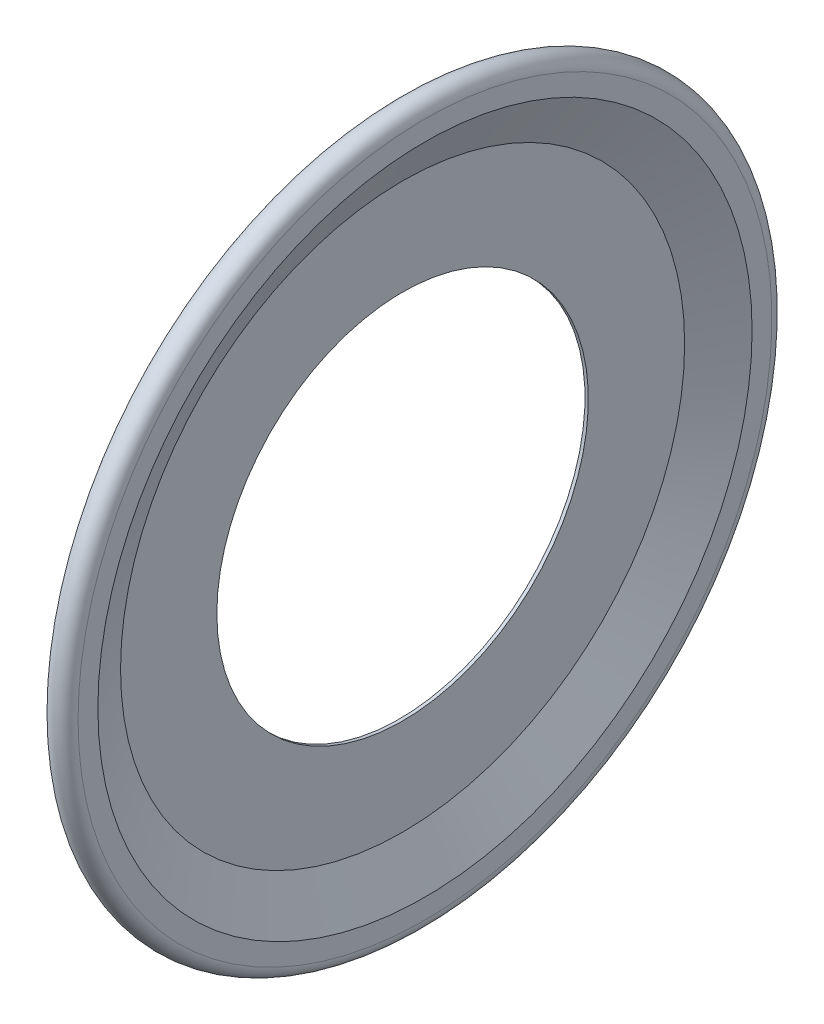
ISO-10303-21;
HEADER;
FILE_DESCRIPTION(('STEP AP214'),'2;1');
FILE_NAME('part.step','',(''),(''),'','','');
FILE_SCHEMA(('AUTOMOTIVE_DESIGN { 1 0 10303 214 1 1 1 1 }'));
ENDSEC;
DATA;
#1=APPLICATION_CONTEXT('core data for automotive mechanical design processes');
#2=APPLICATION_PROTOCOL_DEFINITION('international standard','automotive_design',2000,#1);
#3=PRODUCT_CONTEXT('',#1,'mechanical');
#4=PRODUCT('Part','Part','',(#3));
#5=PRODUCT_RELATED_PRODUCT_CATEGORY('part','',(#4));
#6=PRODUCT_DEFINITION_FORMATION('','',#4);
#7=PRODUCT_DEFINITION_CONTEXT('part definition',#1,'design');
#8=PRODUCT_DEFINITION('design','',#6,#7);
#9=PRODUCT_DEFINITION_SHAPE('','',#8);
#10=(LENGTH_UNIT() NAMED_UNIT(*) SI_UNIT(.MILLI.,.METRE.));
#11=(NAMED_UNIT(*) PLANE_ANGLE_UNIT() SI_UNIT($,.RADIAN.));
#12=(NAMED_UNIT(*) SI_UNIT($,.STERADIAN.) SOLID_ANGLE_UNIT());
#13=UNCERTAINTY_MEASURE_WITH_UNIT(LENGTH_MEASURE(1.E-05),#10,'distance_accuracy_value','');
#14=(GEOMETRIC_REPRESENTATION_CONTEXT(3) GLOBAL_UNCERTAINTY_ASSIGNED_CONTEXT((#13)) GLOBAL_UNIT_ASSIGNED_CONTEXT((#10,
#11,#12)) REPRESENTATION_CONTEXT('',''));
#15=CARTESIAN_POINT('',(0.,0.,0.));
#16=DIRECTION('',(0.,0.,1.));
#17=DIRECTION('',(1.,0.,0.));
#18=AXIS2_PLACEMENT_3D('',#15,#16,#17);
#19=CARTESIAN_POINT('',(0.35,0.,0.));
#20=DIRECTION('',(-1.,0.,0.));
#21=DIRECTION('',(0.,0.,1.));
#22=AXIS2_PLACEMENT_3D('',#19,#20,#21);
#23=TOROIDAL_SURFACE('',#22,6.73733333333333,0.25);
#24=CARTESIAN_POINT('',(0.123423053240837,0.,0.));
#25=DIRECTION('',(-1.,0.,0.));
#26=DIRECTION('',(0.,0.,1.));
#27=AXIS2_PLACEMENT_3D('',#24,#25,#26);
#28=CIRCLE('',#27,6.84298789876851);
#29=CARTESIAN_POINT('',(0.123423053240837,0.,6.84298789876851));
#30=VERTEX_POINT('',#29);
#31=EDGE_CURVE('E10',#30,#30,#28,.T.);
#32=ORIENTED_EDGE('',*,*,#31,.F.);
#33=EDGE_LOOP('',(#32));
#34=FACE_BOUND('',#33,.T.);
#35=CARTESIAN_POINT('',(0.6,0.,0.));
#36=DIRECTION('',(-1.,0.,0.));
#37=DIRECTION('',(0.,0.,1.));
#38=AXIS2_PLACEMENT_3D('',#35,#36,#37);
#39=CIRCLE('',#38,6.73733333333333);
#40=CARTESIAN_POINT('',(0.6,0.,6.73733333333333));
#41=VERTEX_POINT('',#40);
#42=EDGE_CURVE('E64',#41,#41,#39,.T.);
#43=ORIENTED_EDGE('',*,*,#42,.T.);
#44=EDGE_LOOP('',(#43));
#45=FACE_BOUND('',#44,.T.);
#46=ADVANCED_FACE('F14',(#34,#45),#23,.T.);
#47=CARTESIAN_POINT('',(0.123423053240837,0.,0.));
#48=DIRECTION('',(-1.,0.,0.));
#49=DIRECTION('',(0.,0.,1.));
#50=AXIS2_PLACEMENT_3D('',#47,#48,#49);
#51=CONICAL_SURFACE('',#50,6.84298789876851,0.436332312998583);
#52=CARTESIAN_POINT('',(0.182333059398219,0.,0.));
#53=DIRECTION('',(-1.,0.,0.));
#54=DIRECTION('',(0.,0.,1.));
#55=AXIS2_PLACEMENT_3D('',#52,#53,#54);
#56=CIRCLE('',#55,6.81551771175536);
#57=CARTESIAN_POINT('',(0.182333059398219,0.,6.81551771175536));
#58=VERTEX_POINT('',#57);
#59=EDGE_CURVE('E21',#58,#58,#56,.T.);
#60=ORIENTED_EDGE('',*,*,#59,.F.);
#61=EDGE_LOOP('',(#60));
#62=FACE_BOUND('',#61,.T.);
#63=ORIENTED_EDGE('',*,*,#31,.T.);
#64=EDGE_LOOP('',(#63));
#65=FACE_BOUND('',#64,.T.);
#66=ADVANCED_FACE('F107',(#62,#65),#51,.F.);
#67=CARTESIAN_POINT('',(0.35,0.,0.));
#68=DIRECTION('',(-1.,0.,0.));
#69=DIRECTION('',(0.,0.,1.));
#70=AXIS2_PLACEMENT_3D('',#67,#68,#69);
#71=TOROIDAL_SURFACE('',#70,6.73733333333333,0.185);
#72=ORIENTED_EDGE('',*,*,#59,.T.);
#73=EDGE_LOOP('',(#72));
#74=FACE_BOUND('',#73,.T.);
#75=CARTESIAN_POINT('',(0.535,0.,0.));
#76=DIRECTION('',(-1.,0.,0.));
#77=DIRECTION('',(0.,0.,1.));
#78=AXIS2_PLACEMENT_3D('',#75,#76,#77);
#79=CIRCLE('',#78,6.73733333333333);
#80=CARTESIAN_POINT('',(0.535,0.,6.73733333333333));
#81=VERTEX_POINT('',#80);
#82=EDGE_CURVE('E30',#81,#81,#79,.T.);
#83=ORIENTED_EDGE('',*,*,#82,.F.);
#84=EDGE_LOOP('',(#83));
#85=FACE_BOUND('',#84,.T.);
#86=ADVANCED_FACE('F112',(#74,#85),#71,.F.);
#87=CARTESIAN_POINT('',(0.535,6.35233333333334,0.));
#88=DIRECTION('',(-1.,0.,0.));
#89=DIRECTION('',(0.,0.,1.));
#90=AXIS2_PLACEMENT_3D('',#87,#88,#89);
#91=PLANE('',#90);
#92=ORIENTED_EDGE('',*,*,#82,.T.);
#93=EDGE_LOOP('',(#92));
#94=FACE_BOUND('',#93,.T.);
#95=CARTESIAN_POINT('',(0.535,0.,0.));
#96=DIRECTION('',(-1.,0.,0.));
#97=DIRECTION('',(0.,0.,1.));
#98=AXIS2_PLACEMENT_3D('',#95,#96,#97);
#99=CIRCLE('',#98,6.35233333333334);
#100=CARTESIAN_POINT('',(0.535,0.,6.35233333333334));
#101=VERTEX_POINT('',#100);
#102=EDGE_CURVE('E38',#101,#101,#99,.T.);
#103=ORIENTED_EDGE('',*,*,#102,.F.);
#104=EDGE_LOOP('',(#103));
#105=FACE_BOUND('',#104,.T.);
#106=ADVANCED_FACE('F103',(#94,#105),#91,.T.);
#107=CARTESIAN_POINT('',(0.1,0.,0.));
#108=DIRECTION('',(1.,0.,0.));
#109=DIRECTION('',(0.,0.,-1.));
#110=AXIS2_PLACEMENT_3D('',#107,#108,#109);
#111=CONICAL_SURFACE('',#110,5.47733333333333,1.10943704331931);
#112=ORIENTED_EDGE('',*,*,#102,.T.);
#113=EDGE_LOOP('',(#112));
#114=FACE_BOUND('',#113,.T.);
#115=CARTESIAN_POINT('',(0.1,0.,0.));
#116=DIRECTION('',(-1.,0.,0.));
#117=DIRECTION('',(0.,0.,1.));
#118=AXIS2_PLACEMENT_3D('',#115,#116,#117);
#119=CIRCLE('',#118,5.47733333333333);
#120=CARTESIAN_POINT('',(0.1,0.,5.47733333333333));
#121=VERTEX_POINT('',#120);
#122=EDGE_CURVE('E44',#121,#121,#119,.T.);
#123=ORIENTED_EDGE('',*,*,#122,.F.);
#124=EDGE_LOOP('',(#123));
#125=FACE_BOUND('',#124,.T.);
#126=ADVANCED_FACE('F96',(#114,#125),#111,.T.);
#127=CARTESIAN_POINT('',(0.1,3.60733333333333,0.));
#128=DIRECTION('',(-1.,0.,0.));
#129=DIRECTION('',(0.,0.,1.));
#130=AXIS2_PLACEMENT_3D('',#127,#128,#129);
#131=PLANE('',#130);
#132=ORIENTED_EDGE('',*,*,#122,.T.);
#133=EDGE_LOOP('',(#132));
#134=FACE_BOUND('',#133,.T.);
#135=CARTESIAN_POINT('',(0.1,0.,0.));
#136=DIRECTION('',(-1.,0.,0.));
#137=DIRECTION('',(0.,0.,1.));
#138=AXIS2_PLACEMENT_3D('',#135,#136,#137);
#139=CIRCLE('',#138,3.60733333333333);
#140=CARTESIAN_POINT('',(0.1,0.,3.60733333333333));
#141=VERTEX_POINT('',#140);
#142=EDGE_CURVE('E48',#141,#141,#139,.T.);
#143=ORIENTED_EDGE('',*,*,#142,.F.);
#144=EDGE_LOOP('',(#143));
#145=FACE_BOUND('',#144,.T.);
#146=ADVANCED_FACE('F91',(#134,#145),#131,.T.);
#147=CARTESIAN_POINT('',(0.,0.,0.));
#148=DIRECTION('',(-1.,0.,0.));
#149=DIRECTION('',(0.,0.,1.));
#150=AXIS2_PLACEMENT_3D('',#147,#148,#149);
#151=CYLINDRICAL_SURFACE('',#150,3.60733333333333);
#152=CARTESIAN_POINT('',(0.165,0.,0.));
#153=DIRECTION('',(-1.,0.,0.));
#154=DIRECTION('',(0.,0.,1.));
#155=AXIS2_PLACEMENT_3D('',#152,#153,#154);
#156=CIRCLE('',#155,3.60733333333333);
#157=CARTESIAN_POINT('',(0.165,0.,3.60733333333333));
#158=VERTEX_POINT('',#157);
#159=EDGE_CURVE('E52',#158,#158,#156,.T.);
#160=ORIENTED_EDGE('',*,*,#159,.F.);
#161=EDGE_LOOP('',(#160));
#162=FACE_BOUND('',#161,.T.);
#163=ORIENTED_EDGE('',*,*,#142,.T.);
#164=EDGE_LOOP('',(#163));
#165=FACE_BOUND('',#164,.T.);
#166=ADVANCED_FACE('F85',(#162,#165),#151,.F.);
#167=CARTESIAN_POINT('',(0.165,3.60733333333333,0.));
#168=DIRECTION('',(-1.,0.,0.));
#169=DIRECTION('',(0.,0.,1.));
#170=AXIS2_PLACEMENT_3D('',#167,#168,#169);
#171=PLANE('',#170);
#172=CARTESIAN_POINT('',(0.165,0.,0.));
#173=DIRECTION('',(-1.,0.,0.));
#174=DIRECTION('',(0.,0.,1.));
#175=AXIS2_PLACEMENT_3D('',#172,#173,#174);
#176=CIRCLE('',#175,5.47733333333333);
#177=CARTESIAN_POINT('',(0.165,0.,5.47733333333333));
#178=VERTEX_POINT('',#177);
#179=EDGE_CURVE('E56',#178,#178,#176,.T.);
#180=ORIENTED_EDGE('',*,*,#179,.F.);
#181=EDGE_LOOP('',(#180));
#182=FACE_BOUND('',#181,.T.);
#183=ORIENTED_EDGE('',*,*,#159,.T.);
#184=EDGE_LOOP('',(#183));
#185=FACE_BOUND('',#184,.T.);
#186=ADVANCED_FACE('F79',(#182,#185),#171,.F.);
#187=CARTESIAN_POINT('',(0.165,0.,0.));
#188=DIRECTION('',(1.,0.,0.));
#189=DIRECTION('',(0.,0.,-1.));
#190=AXIS2_PLACEMENT_3D('',#187,#188,#189);
#191=CONICAL_SURFACE('',#190,5.47733333333333,1.10943704331931);
#192=CARTESIAN_POINT('',(0.6,0.,0.));
#193=DIRECTION('',(-1.,0.,0.));
#194=DIRECTION('',(0.,0.,1.));
#195=AXIS2_PLACEMENT_3D('',#192,#193,#194);
#196=CIRCLE('',#195,6.35233333333334);
#197=CARTESIAN_POINT('',(0.6,0.,6.35233333333334));
#198=VERTEX_POINT('',#197);
#199=EDGE_CURVE('E60',#198,#198,#196,.T.);
#200=ORIENTED_EDGE('',*,*,#199,.F.);
#201=EDGE_LOOP('',(#200));
#202=FACE_BOUND('',#201,.T.);
#203=ORIENTED_EDGE('',*,*,#179,.T.);
#204=EDGE_LOOP('',(#203));
#205=FACE_BOUND('',#204,.T.);
#206=ADVANCED_FACE('F73',(#202,#205),#191,.F.);
#207=CARTESIAN_POINT('',(0.6,6.35233333333334,0.));
#208=DIRECTION('',(-1.,0.,0.));
#209=DIRECTION('',(0.,0.,1.));
#210=AXIS2_PLACEMENT_3D('',#207,#208,#209);
#211=PLANE('',#210);
#212=ORIENTED_EDGE('',*,*,#42,.F.);
#213=EDGE_LOOP('',(#212));
#214=FACE_BOUND('',#213,.T.);
#215=ORIENTED_EDGE('',*,*,#199,.T.);
#216=EDGE_LOOP('',(#215));
#217=FACE_BOUND('',#216,.T.);
#218=ADVANCED_FACE('F70',(#214,#217),#211,.F.);
#219=CLOSED_SHELL('',(#46,#66,#86,#106,#126,#146,#166,#186,#206,#218));
#220=MANIFOLD_SOLID_BREP('B1',#219);
#221=ADVANCED_BREP_SHAPE_REPRESENTATION('',(#18,#220),#14);
#222=SHAPE_DEFINITION_REPRESENTATION(#9,#221);
ENDSEC;
END-ISO-10303-21;
